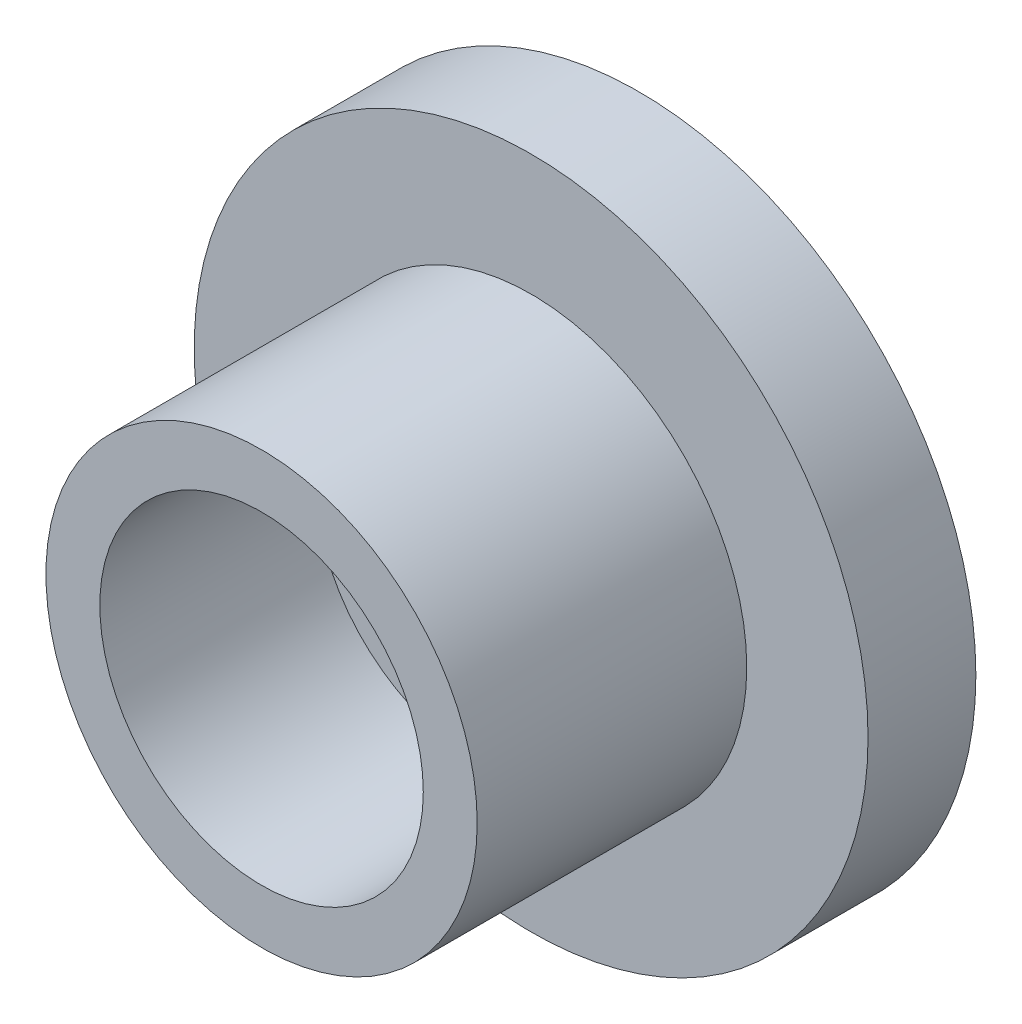
ISO-10303-21;
HEADER;
FILE_DESCRIPTION(('STEP AP214'),'2;1');
FILE_NAME('part.step','',(''),(''),'','','');
FILE_SCHEMA(('AUTOMOTIVE_DESIGN { 1 0 10303 214 1 1 1 1 }'));
ENDSEC;
DATA;
#1=APPLICATION_CONTEXT('core data for automotive mechanical design processes');
#2=APPLICATION_PROTOCOL_DEFINITION('international standard','automotive_design',2000,#1);
#3=PRODUCT_CONTEXT('',#1,'mechanical');
#4=PRODUCT('Part','Part','',(#3));
#5=PRODUCT_RELATED_PRODUCT_CATEGORY('part','',(#4));
#6=PRODUCT_DEFINITION_FORMATION('','',#4);
#7=PRODUCT_DEFINITION_CONTEXT('part definition',#1,'design');
#8=PRODUCT_DEFINITION('design','',#6,#7);
#9=PRODUCT_DEFINITION_SHAPE('','',#8);
#10=(LENGTH_UNIT() NAMED_UNIT(*) SI_UNIT(.MILLI.,.METRE.));
#11=(NAMED_UNIT(*) PLANE_ANGLE_UNIT() SI_UNIT($,.RADIAN.));
#12=(NAMED_UNIT(*) SI_UNIT($,.STERADIAN.) SOLID_ANGLE_UNIT());
#13=UNCERTAINTY_MEASURE_WITH_UNIT(LENGTH_MEASURE(1.E-05),#10,'distance_accuracy_value','');
#14=(GEOMETRIC_REPRESENTATION_CONTEXT(3) GLOBAL_UNCERTAINTY_ASSIGNED_CONTEXT((#13)) GLOBAL_UNIT_ASSIGNED_CONTEXT((#10,
#11,#12)) REPRESENTATION_CONTEXT('',''));
#15=CARTESIAN_POINT('',(0.,0.,0.));
#16=DIRECTION('',(0.,0.,1.));
#17=DIRECTION('',(1.,0.,0.));
#18=AXIS2_PLACEMENT_3D('',#15,#16,#17);
#19=CARTESIAN_POINT('',(0.,0.,0.));
#20=DIRECTION('',(0.,0.,1.));
#21=DIRECTION('',(1.,0.,0.));
#22=AXIS2_PLACEMENT_3D('',#19,#20,#21);
#23=CYLINDRICAL_SURFACE('',#22,2.5);
#24=CARTESIAN_POINT('',(0.,0.,6.));
#25=DIRECTION('',(0.,0.,1.));
#26=DIRECTION('',(1.,0.,0.));
#27=AXIS2_PLACEMENT_3D('',#24,#25,#26);
#28=CIRCLE('',#27,2.5);
#29=CARTESIAN_POINT('',(2.5,0.,6.));
#30=VERTEX_POINT('',#29);
#31=EDGE_CURVE('E49',#30,#30,#28,.F.);
#32=ORIENTED_EDGE('',*,*,#31,.F.);
#33=EDGE_LOOP('',(#32));
#34=FACE_BOUND('',#33,.T.);
#35=CARTESIAN_POINT('',(0.,0.,5.));
#36=DIRECTION('',(0.,0.,-1.));
#37=DIRECTION('',(-1.,0.,0.));
#38=AXIS2_PLACEMENT_3D('',#35,#36,#37);
#39=CIRCLE('',#38,2.5);
#40=CARTESIAN_POINT('',(-2.5,0.,5.));
#41=VERTEX_POINT('',#40);
#42=EDGE_CURVE('E35',#41,#41,#39,.F.);
#43=ORIENTED_EDGE('',*,*,#42,.F.);
#44=EDGE_LOOP('',(#43));
#45=FACE_BOUND('',#44,.T.);
#46=ADVANCED_FACE('F31',(#34,#45),#23,.F.);
#47=CARTESIAN_POINT('',(0.,0.,4.));
#48=DIRECTION('',(0.,0.,-1.));
#49=DIRECTION('',(-1.,0.,0.));
#50=AXIS2_PLACEMENT_3D('',#47,#48,#49);
#51=CYLINDRICAL_SURFACE('',#50,12.5);
#52=CARTESIAN_POINT('',(0.,0.,4.));
#53=DIRECTION('',(0.,0.,1.));
#54=DIRECTION('',(1.,0.,0.));
#55=AXIS2_PLACEMENT_3D('',#52,#53,#54);
#56=CIRCLE('',#55,12.5);
#57=CARTESIAN_POINT('',(12.5,0.,4.));
#58=VERTEX_POINT('',#57);
#59=EDGE_CURVE('E10',#58,#58,#56,.T.);
#60=ORIENTED_EDGE('',*,*,#59,.F.);
#61=EDGE_LOOP('',(#60));
#62=FACE_BOUND('',#61,.T.);
#63=CARTESIAN_POINT('',(0.,0.,0.));
#64=DIRECTION('',(0.,0.,1.));
#65=DIRECTION('',(1.,0.,0.));
#66=AXIS2_PLACEMENT_3D('',#63,#64,#65);
#67=CIRCLE('',#66,12.5);
#68=CARTESIAN_POINT('',(12.5,0.,0.));
#69=VERTEX_POINT('',#68);
#70=EDGE_CURVE('E39',#69,#69,#67,.T.);
#71=ORIENTED_EDGE('',*,*,#70,.T.);
#72=EDGE_LOOP('',(#71));
#73=FACE_BOUND('',#72,.T.);
#74=ADVANCED_FACE('F33',(#62,#73),#51,.T.);
#75=CARTESIAN_POINT('',(0.,0.,4.));
#76=DIRECTION('',(0.,0.,1.));
#77=DIRECTION('',(1.,0.,0.));
#78=AXIS2_PLACEMENT_3D('',#75,#76,#77);
#79=PLANE('',#78);
#80=CARTESIAN_POINT('',(0.,0.,4.));
#81=DIRECTION('',(0.,0.,1.));
#82=DIRECTION('',(1.,0.,0.));
#83=AXIS2_PLACEMENT_3D('',#80,#81,#82);
#84=CIRCLE('',#83,8.);
#85=CARTESIAN_POINT('',(8.,0.,4.));
#86=VERTEX_POINT('',#85);
#87=EDGE_CURVE('E47',#86,#86,#84,.T.);
#88=ORIENTED_EDGE('',*,*,#87,.F.);
#89=EDGE_LOOP('',(#88));
#90=FACE_BOUND('',#89,.T.);
#91=ORIENTED_EDGE('',*,*,#59,.T.);
#92=EDGE_LOOP('',(#91));
#93=FACE_BOUND('',#92,.T.);
#94=ADVANCED_FACE('F77',(#90,#93),#79,.T.);
#95=CARTESIAN_POINT('',(0.,0.,0.));
#96=DIRECTION('',(0.,0.,1.));
#97=DIRECTION('',(1.,0.,0.));
#98=AXIS2_PLACEMENT_3D('',#95,#96,#97);
#99=PLANE('',#98);
#100=CARTESIAN_POINT('',(0.,0.,0.));
#101=DIRECTION('',(0.,0.,-1.));
#102=DIRECTION('',(-1.,0.,0.));
#103=AXIS2_PLACEMENT_3D('',#100,#101,#102);
#104=CIRCLE('',#103,6.);
#105=CARTESIAN_POINT('',(-6.,0.,0.));
#106=VERTEX_POINT('',#105);
#107=EDGE_CURVE('E63',#106,#106,#104,.T.);
#108=ORIENTED_EDGE('',*,*,#107,.F.);
#109=EDGE_LOOP('',(#108));
#110=FACE_BOUND('',#109,.T.);
#111=ORIENTED_EDGE('',*,*,#70,.F.);
#112=EDGE_LOOP('',(#111));
#113=FACE_BOUND('',#112,.T.);
#114=ADVANCED_FACE('F73',(#110,#113),#99,.F.);
#115=CARTESIAN_POINT('',(0.,0.,14.));
#116=DIRECTION('',(0.,0.,-1.));
#117=DIRECTION('',(-1.,0.,0.));
#118=AXIS2_PLACEMENT_3D('',#115,#116,#117);
#119=CYLINDRICAL_SURFACE('',#118,8.);
#120=CARTESIAN_POINT('',(0.,0.,14.));
#121=DIRECTION('',(0.,0.,1.));
#122=DIRECTION('',(1.,0.,0.));
#123=AXIS2_PLACEMENT_3D('',#120,#121,#122);
#124=CIRCLE('',#123,8.);
#125=CARTESIAN_POINT('',(8.,0.,14.));
#126=VERTEX_POINT('',#125);
#127=EDGE_CURVE('E44',#126,#126,#124,.T.);
#128=ORIENTED_EDGE('',*,*,#127,.F.);
#129=EDGE_LOOP('',(#128));
#130=FACE_BOUND('',#129,.T.);
#131=ORIENTED_EDGE('',*,*,#87,.T.);
#132=EDGE_LOOP('',(#131));
#133=FACE_BOUND('',#132,.T.);
#134=ADVANCED_FACE('F70',(#130,#133),#119,.T.);
#135=CARTESIAN_POINT('',(0.,0.,14.));
#136=DIRECTION('',(0.,0.,1.));
#137=DIRECTION('',(1.,0.,0.));
#138=AXIS2_PLACEMENT_3D('',#135,#136,#137);
#139=PLANE('',#138);
#140=CARTESIAN_POINT('',(0.,0.,14.));
#141=DIRECTION('',(0.,0.,1.));
#142=DIRECTION('',(1.,0.,0.));
#143=AXIS2_PLACEMENT_3D('',#140,#141,#142);
#144=CIRCLE('',#143,6.);
#145=CARTESIAN_POINT('',(6.,0.,14.));
#146=VERTEX_POINT('',#145);
#147=EDGE_CURVE('E56',#146,#146,#144,.T.);
#148=ORIENTED_EDGE('',*,*,#147,.F.);
#149=EDGE_LOOP('',(#148));
#150=FACE_BOUND('',#149,.T.);
#151=ORIENTED_EDGE('',*,*,#127,.T.);
#152=EDGE_LOOP('',(#151));
#153=FACE_BOUND('',#152,.T.);
#154=ADVANCED_FACE('F68',(#150,#153),#139,.T.);
#155=CARTESIAN_POINT('',(0.,0.,6.));
#156=DIRECTION('',(0.,0.,1.));
#157=DIRECTION('',(1.,0.,0.));
#158=AXIS2_PLACEMENT_3D('',#155,#156,#157);
#159=PLANE('',#158);
#160=CARTESIAN_POINT('',(0.,0.,6.));
#161=DIRECTION('',(0.,0.,1.));
#162=DIRECTION('',(1.,0.,0.));
#163=AXIS2_PLACEMENT_3D('',#160,#161,#162);
#164=CIRCLE('',#163,6.);
#165=CARTESIAN_POINT('',(6.,0.,6.));
#166=VERTEX_POINT('',#165);
#167=EDGE_CURVE('E51',#166,#166,#164,.T.);
#168=ORIENTED_EDGE('',*,*,#167,.T.);
#169=EDGE_LOOP('',(#168));
#170=FACE_BOUND('',#169,.T.);
#171=ORIENTED_EDGE('',*,*,#31,.T.);
#172=EDGE_LOOP('',(#171));
#173=FACE_BOUND('',#172,.T.);
#174=ADVANCED_FACE('F97',(#170,#173),#159,.T.);
#175=CARTESIAN_POINT('',(0.,0.,6.));
#176=DIRECTION('',(0.,0.,1.));
#177=DIRECTION('',(1.,0.,0.));
#178=AXIS2_PLACEMENT_3D('',#175,#176,#177);
#179=CYLINDRICAL_SURFACE('',#178,6.);
#180=ORIENTED_EDGE('',*,*,#167,.F.);
#181=EDGE_LOOP('',(#180));
#182=FACE_BOUND('',#181,.T.);
#183=ORIENTED_EDGE('',*,*,#147,.T.);
#184=EDGE_LOOP('',(#183));
#185=FACE_BOUND('',#184,.T.);
#186=ADVANCED_FACE('F94',(#182,#185),#179,.F.);
#187=CARTESIAN_POINT('',(0.,0.,5.));
#188=DIRECTION('',(0.,0.,-1.));
#189=DIRECTION('',(-1.,0.,0.));
#190=AXIS2_PLACEMENT_3D('',#187,#188,#189);
#191=PLANE('',#190);
#192=CARTESIAN_POINT('',(0.,0.,5.));
#193=DIRECTION('',(0.,0.,-1.));
#194=DIRECTION('',(-1.,0.,0.));
#195=AXIS2_PLACEMENT_3D('',#192,#193,#194);
#196=CIRCLE('',#195,6.);
#197=CARTESIAN_POINT('',(-6.,0.,5.));
#198=VERTEX_POINT('',#197);
#199=EDGE_CURVE('E121',#198,#198,#196,.T.);
#200=ORIENTED_EDGE('',*,*,#199,.T.);
#201=EDGE_LOOP('',(#200));
#202=FACE_BOUND('',#201,.T.);
#203=ORIENTED_EDGE('',*,*,#42,.T.);
#204=EDGE_LOOP('',(#203));
#205=FACE_BOUND('',#204,.T.);
#206=ADVANCED_FACE('F105',(#202,#205),#191,.T.);
#207=CARTESIAN_POINT('',(0.,0.,5.));
#208=DIRECTION('',(0.,0.,-1.));
#209=DIRECTION('',(-1.,0.,0.));
#210=AXIS2_PLACEMENT_3D('',#207,#208,#209);
#211=CYLINDRICAL_SURFACE('',#210,6.);
#212=ORIENTED_EDGE('',*,*,#199,.F.);
#213=EDGE_LOOP('',(#212));
#214=FACE_BOUND('',#213,.T.);
#215=ORIENTED_EDGE('',*,*,#107,.T.);
#216=EDGE_LOOP('',(#215));
#217=FACE_BOUND('',#216,.T.);
#218=ADVANCED_FACE('F110',(#214,#217),#211,.F.);
#219=CLOSED_SHELL('',(#46,#74,#94,#114,#134,#154,#174,#186,#206,#218));
#220=MANIFOLD_SOLID_BREP('B2',#219);
#221=ADVANCED_BREP_SHAPE_REPRESENTATION('',(#18,#220),#14);
#222=SHAPE_DEFINITION_REPRESENTATION(#9,#221);
ENDSEC;
END-ISO-10303-21;
